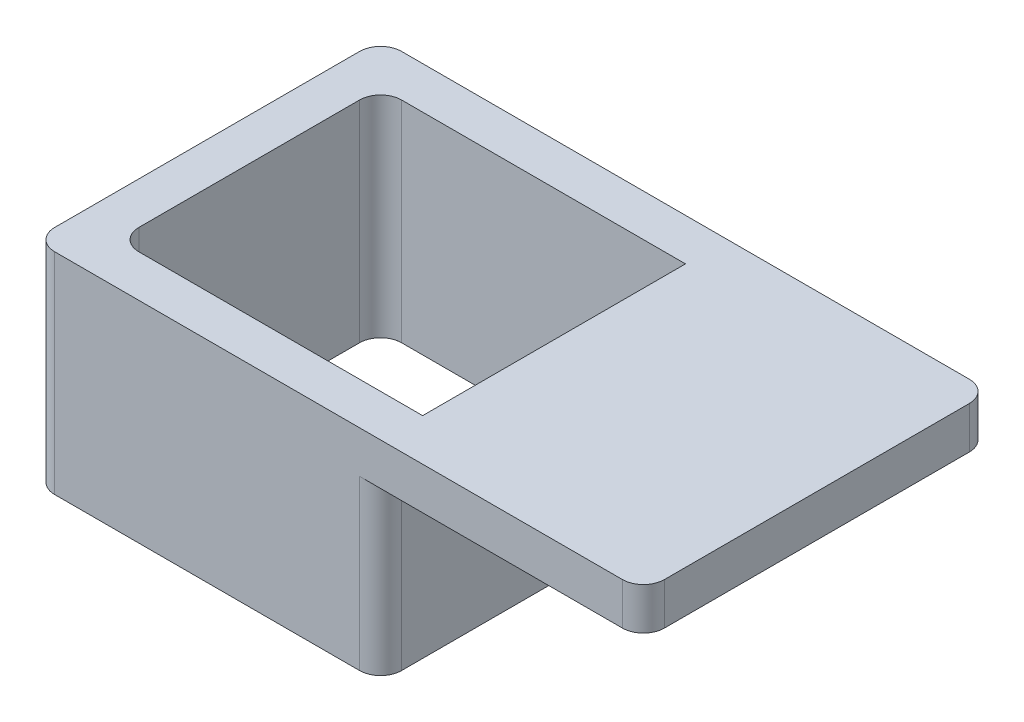
ISO-10303-21;
HEADER;
FILE_DESCRIPTION(('STEP AP214'),'2;1');
FILE_NAME('part.step','',(''),(''),'','','');
FILE_SCHEMA(('AUTOMOTIVE_DESIGN { 1 0 10303 214 1 1 1 1 }'));
ENDSEC;
DATA;
#1=APPLICATION_CONTEXT('core data for automotive mechanical design processes');
#2=APPLICATION_PROTOCOL_DEFINITION('international standard','automotive_design',2000,#1);
#3=PRODUCT_CONTEXT('',#1,'mechanical');
#4=PRODUCT('Part','Part','',(#3));
#5=PRODUCT_RELATED_PRODUCT_CATEGORY('part','',(#4));
#6=PRODUCT_DEFINITION_FORMATION('','',#4);
#7=PRODUCT_DEFINITION_CONTEXT('part definition',#1,'design');
#8=PRODUCT_DEFINITION('design','',#6,#7);
#9=PRODUCT_DEFINITION_SHAPE('','',#8);
#10=(LENGTH_UNIT() NAMED_UNIT(*) SI_UNIT(.MILLI.,.METRE.));
#11=(NAMED_UNIT(*) PLANE_ANGLE_UNIT() SI_UNIT($,.RADIAN.));
#12=(NAMED_UNIT(*) SI_UNIT($,.STERADIAN.) SOLID_ANGLE_UNIT());
#13=UNCERTAINTY_MEASURE_WITH_UNIT(LENGTH_MEASURE(1.E-05),#10,'distance_accuracy_value','');
#14=(GEOMETRIC_REPRESENTATION_CONTEXT(3) GLOBAL_UNCERTAINTY_ASSIGNED_CONTEXT((#13)) GLOBAL_UNIT_ASSIGNED_CONTEXT((#10,
#11,#12)) REPRESENTATION_CONTEXT('',''));
#15=CARTESIAN_POINT('',(0.,0.,0.));
#16=DIRECTION('',(0.,0.,1.));
#17=DIRECTION('',(1.,0.,0.));
#18=AXIS2_PLACEMENT_3D('',#15,#16,#17);
#19=CARTESIAN_POINT('',(8.25,10.,-8.25));
#20=DIRECTION('',(-1.,0.,0.));
#21=DIRECTION('',(0.,0.,1.));
#22=AXIS2_PLACEMENT_3D('',#19,#20,#21);
#23=PLANE('',#22);
#24=DIRECTION('',(0.,0.,-1.));
#25=VECTOR('',#24,1.);
#26=CARTESIAN_POINT('',(8.25,8.,8.25));
#27=LINE('',#26,#25);
#28=CARTESIAN_POINT('',(8.25,8.,7.25));
#29=VERTEX_POINT('',#28);
#30=CARTESIAN_POINT('',(8.25,8.,-7.25));
#31=VERTEX_POINT('',#30);
#32=EDGE_CURVE('E319',#29,#31,#27,.T.);
#33=ORIENTED_EDGE('',*,*,#32,.F.);
#34=DIRECTION('',(0.,-1.,0.));
#35=VECTOR('',#34,1.);
#36=CARTESIAN_POINT('',(8.25,10.,7.25));
#37=LINE('',#36,#35);
#38=CARTESIAN_POINT('',(8.25,0.,7.25));
#39=VERTEX_POINT('',#38);
#40=EDGE_CURVE('E262',#29,#39,#37,.T.);
#41=ORIENTED_EDGE('',*,*,#40,.T.);
#42=DIRECTION('',(0.,0.,-1.));
#43=VECTOR('',#42,1.);
#44=CARTESIAN_POINT('',(8.25,0.,-8.25));
#45=LINE('',#44,#43);
#46=CARTESIAN_POINT('',(8.25,0.,-7.25));
#47=VERTEX_POINT('',#46);
#48=EDGE_CURVE('E217',#39,#47,#45,.T.);
#49=ORIENTED_EDGE('',*,*,#48,.T.);
#50=DIRECTION('',(0.,-1.,0.));
#51=VECTOR('',#50,1.);
#52=CARTESIAN_POINT('',(8.25,10.,-7.25));
#53=LINE('',#52,#51);
#54=EDGE_CURVE('E260',#47,#31,#53,.F.);
#55=ORIENTED_EDGE('',*,*,#54,.T.);
#56=EDGE_LOOP('',(#33,#41,#49,#55));
#57=FACE_BOUND('',#56,.T.);
#58=ADVANCED_FACE('F39',(#57),#23,.F.);
#59=CARTESIAN_POINT('',(0.,10.,0.));
#60=DIRECTION('',(0.,-1.,0.));
#61=DIRECTION('',(0.,0.,-1.));
#62=AXIS2_PLACEMENT_3D('',#59,#60,#61);
#63=PLANE('',#62);
#64=DIRECTION('',(0.,0.,1.));
#65=VECTOR('',#64,1.);
#66=CARTESIAN_POINT('',(20.75,10.,8.25));
#67=LINE('',#66,#65);
#68=CARTESIAN_POINT('',(20.75,10.,-7.25));
#69=VERTEX_POINT('',#68);
#70=CARTESIAN_POINT('',(20.75,10.,7.25));
#71=VERTEX_POINT('',#70);
#72=EDGE_CURVE('E318',#69,#71,#67,.T.);
#73=ORIENTED_EDGE('',*,*,#72,.F.);
#74=CARTESIAN_POINT('',(19.75,10.,-7.25));
#75=DIRECTION('',(0.,-1.,0.));
#76=DIRECTION('',(0.,0.,-1.));
#77=AXIS2_PLACEMENT_3D('',#74,#75,#76);
#78=CIRCLE('',#77,1.);
#79=CARTESIAN_POINT('',(19.75,10.,-8.25));
#80=VERTEX_POINT('',#79);
#81=EDGE_CURVE('E239',#69,#80,#78,.F.);
#82=ORIENTED_EDGE('',*,*,#81,.T.);
#83=DIRECTION('',(-1.,0.,0.));
#84=VECTOR('',#83,1.);
#85=CARTESIAN_POINT('',(8.25,10.,-8.25));
#86=LINE('',#85,#84);
#87=CARTESIAN_POINT('',(-7.25,10.,-8.25));
#88=VERTEX_POINT('',#87);
#89=EDGE_CURVE('E208',#80,#88,#86,.T.);
#90=ORIENTED_EDGE('',*,*,#89,.T.);
#91=CARTESIAN_POINT('',(-7.25,10.,-7.25));
#92=DIRECTION('',(0.,-1.,0.));
#93=DIRECTION('',(0.,0.,-1.));
#94=AXIS2_PLACEMENT_3D('',#91,#92,#93);
#95=CIRCLE('',#94,1.);
#96=CARTESIAN_POINT('',(-8.25,10.,-7.25));
#97=VERTEX_POINT('',#96);
#98=EDGE_CURVE('E235',#88,#97,#95,.F.);
#99=ORIENTED_EDGE('',*,*,#98,.T.);
#100=DIRECTION('',(0.,0.,1.));
#101=VECTOR('',#100,1.);
#102=CARTESIAN_POINT('',(-8.25,10.,-8.25));
#103=LINE('',#102,#101);
#104=CARTESIAN_POINT('',(-8.25,10.,7.25));
#105=VERTEX_POINT('',#104);
#106=EDGE_CURVE('E198',#97,#105,#103,.T.);
#107=ORIENTED_EDGE('',*,*,#106,.T.);
#108=CARTESIAN_POINT('',(-7.25,10.,7.25));
#109=DIRECTION('',(0.,-1.,0.));
#110=DIRECTION('',(0.,0.,-1.));
#111=AXIS2_PLACEMENT_3D('',#108,#109,#110);
#112=CIRCLE('',#111,1.);
#113=CARTESIAN_POINT('',(-7.25,10.,8.25));
#114=VERTEX_POINT('',#113);
#115=EDGE_CURVE('E233',#105,#114,#112,.F.);
#116=ORIENTED_EDGE('',*,*,#115,.T.);
#117=DIRECTION('',(1.,0.,0.));
#118=VECTOR('',#117,1.);
#119=CARTESIAN_POINT('',(8.25,10.,8.25));
#120=LINE('',#119,#118);
#121=CARTESIAN_POINT('',(19.75,10.,8.25));
#122=VERTEX_POINT('',#121);
#123=EDGE_CURVE('E201',#114,#122,#120,.T.);
#124=ORIENTED_EDGE('',*,*,#123,.T.);
#125=CARTESIAN_POINT('',(19.75,10.,7.25));
#126=DIRECTION('',(0.,-1.,0.));
#127=DIRECTION('',(0.,0.,-1.));
#128=AXIS2_PLACEMENT_3D('',#125,#126,#127);
#129=CIRCLE('',#128,1.);
#130=EDGE_CURVE('E237',#122,#71,#129,.F.);
#131=ORIENTED_EDGE('',*,*,#130,.T.);
#132=EDGE_LOOP('',(#73,#82,#90,#99,#107,#116,#124,#131));
#133=FACE_BOUND('',#132,.T.);
#134=DIRECTION('',(-1.,0.,0.));
#135=VECTOR('',#134,1.);
#136=CARTESIAN_POINT('',(6.25,10.,-6.25));
#137=LINE('',#136,#135);
#138=CARTESIAN_POINT('',(8.25,10.,-6.25));
#139=VERTEX_POINT('',#138);
#140=CARTESIAN_POINT('',(-5.25,10.,-6.25));
#141=VERTEX_POINT('',#140);
#142=EDGE_CURVE('E196',#139,#141,#137,.T.);
#143=ORIENTED_EDGE('',*,*,#142,.F.);
#144=DIRECTION('',(0.,0.,-1.));
#145=VECTOR('',#144,1.);
#146=CARTESIAN_POINT('',(8.25,10.,-8.25));
#147=LINE('',#146,#145);
#148=CARTESIAN_POINT('',(8.25,10.,6.25));
#149=VERTEX_POINT('',#148);
#150=EDGE_CURVE('E205',#149,#139,#147,.T.);
#151=ORIENTED_EDGE('',*,*,#150,.F.);
#152=DIRECTION('',(1.,0.,0.));
#153=VECTOR('',#152,1.);
#154=CARTESIAN_POINT('',(6.25,10.,6.25));
#155=LINE('',#154,#153);
#156=CARTESIAN_POINT('',(-5.25,10.,6.25));
#157=VERTEX_POINT('',#156);
#158=EDGE_CURVE('E310',#157,#149,#155,.T.);
#159=ORIENTED_EDGE('',*,*,#158,.F.);
#160=CARTESIAN_POINT('',(-5.25,10.,5.25));
#161=DIRECTION('',(0.,-1.,0.));
#162=DIRECTION('',(0.,0.,-1.));
#163=AXIS2_PLACEMENT_3D('',#160,#161,#162);
#164=CIRCLE('',#163,1.);
#165=CARTESIAN_POINT('',(-6.25,10.,5.25));
#166=VERTEX_POINT('',#165);
#167=EDGE_CURVE('E293',#157,#166,#164,.T.);
#168=ORIENTED_EDGE('',*,*,#167,.T.);
#169=DIRECTION('',(0.,0.,1.));
#170=VECTOR('',#169,1.);
#171=CARTESIAN_POINT('',(-6.25,10.,-6.25));
#172=LINE('',#171,#170);
#173=CARTESIAN_POINT('',(-6.25,10.,-5.25));
#174=VERTEX_POINT('',#173);
#175=EDGE_CURVE('E192',#174,#166,#172,.T.);
#176=ORIENTED_EDGE('',*,*,#175,.F.);
#177=CARTESIAN_POINT('',(-5.25,10.,-5.25));
#178=DIRECTION('',(0.,-1.,0.));
#179=DIRECTION('',(0.,0.,-1.));
#180=AXIS2_PLACEMENT_3D('',#177,#178,#179);
#181=CIRCLE('',#180,1.);
#182=EDGE_CURVE('E11',#174,#141,#181,.T.);
#183=ORIENTED_EDGE('',*,*,#182,.T.);
#184=EDGE_LOOP('',(#143,#151,#159,#168,#176,#183));
#185=FACE_BOUND('',#184,.T.);
#186=ADVANCED_FACE('F306',(#133,#185),#63,.F.);
#187=CARTESIAN_POINT('',(0.,0.,0.));
#188=DIRECTION('',(0.,-1.,0.));
#189=DIRECTION('',(0.,0.,-1.));
#190=AXIS2_PLACEMENT_3D('',#187,#188,#189);
#191=PLANE('',#190);
#192=ORIENTED_EDGE('',*,*,#48,.F.);
#193=CARTESIAN_POINT('',(7.25,0.,7.25));
#194=DIRECTION('',(0.,-1.,0.));
#195=DIRECTION('',(0.,0.,-1.));
#196=AXIS2_PLACEMENT_3D('',#193,#194,#195);
#197=CIRCLE('',#196,1.);
#198=CARTESIAN_POINT('',(7.25,0.,8.25));
#199=VERTEX_POINT('',#198);
#200=EDGE_CURVE('E271',#39,#199,#197,.T.);
#201=ORIENTED_EDGE('',*,*,#200,.T.);
#202=DIRECTION('',(1.,0.,0.));
#203=VECTOR('',#202,1.);
#204=CARTESIAN_POINT('',(8.25,0.,8.25));
#205=LINE('',#204,#203);
#206=CARTESIAN_POINT('',(-7.25,0.,8.25));
#207=VERTEX_POINT('',#206);
#208=EDGE_CURVE('E214',#207,#199,#205,.T.);
#209=ORIENTED_EDGE('',*,*,#208,.F.);
#210=CARTESIAN_POINT('',(-7.25,0.,7.25));
#211=DIRECTION('',(0.,-1.,0.));
#212=DIRECTION('',(0.,0.,-1.));
#213=AXIS2_PLACEMENT_3D('',#210,#211,#212);
#214=CIRCLE('',#213,1.);
#215=CARTESIAN_POINT('',(-8.25,0.,7.25));
#216=VERTEX_POINT('',#215);
#217=EDGE_CURVE('E265',#207,#216,#214,.T.);
#218=ORIENTED_EDGE('',*,*,#217,.T.);
#219=DIRECTION('',(0.,0.,1.));
#220=VECTOR('',#219,1.);
#221=CARTESIAN_POINT('',(-8.25,0.,-8.25));
#222=LINE('',#221,#220);
#223=CARTESIAN_POINT('',(-8.25,0.,-7.25));
#224=VERTEX_POINT('',#223);
#225=EDGE_CURVE('E184',#224,#216,#222,.T.);
#226=ORIENTED_EDGE('',*,*,#225,.F.);
#227=CARTESIAN_POINT('',(-7.25,0.,-7.25));
#228=DIRECTION('',(0.,-1.,0.));
#229=DIRECTION('',(0.,0.,-1.));
#230=AXIS2_PLACEMENT_3D('',#227,#228,#229);
#231=CIRCLE('',#230,1.);
#232=CARTESIAN_POINT('',(-7.25,0.,-8.25));
#233=VERTEX_POINT('',#232);
#234=EDGE_CURVE('E267',#224,#233,#231,.T.);
#235=ORIENTED_EDGE('',*,*,#234,.T.);
#236=DIRECTION('',(-1.,0.,0.));
#237=VECTOR('',#236,1.);
#238=CARTESIAN_POINT('',(8.25,0.,-8.25));
#239=LINE('',#238,#237);
#240=CARTESIAN_POINT('',(7.25,0.,-8.25));
#241=VERTEX_POINT('',#240);
#242=EDGE_CURVE('E202',#241,#233,#239,.T.);
#243=ORIENTED_EDGE('',*,*,#242,.F.);
#244=CARTESIAN_POINT('',(7.25,0.,-7.25));
#245=DIRECTION('',(0.,-1.,0.));
#246=DIRECTION('',(0.,0.,-1.));
#247=AXIS2_PLACEMENT_3D('',#244,#245,#246);
#248=CIRCLE('',#247,1.);
#249=EDGE_CURVE('E269',#241,#47,#248,.T.);
#250=ORIENTED_EDGE('',*,*,#249,.T.);
#251=EDGE_LOOP('',(#192,#201,#209,#218,#226,#235,#243,#250));
#252=FACE_BOUND('',#251,.T.);
#253=DIRECTION('',(-1.,0.,0.));
#254=VECTOR('',#253,1.);
#255=CARTESIAN_POINT('',(6.25,0.,-6.25));
#256=LINE('',#255,#254);
#257=CARTESIAN_POINT('',(6.25,0.,-6.25));
#258=VERTEX_POINT('',#257);
#259=CARTESIAN_POINT('',(-5.25,0.,-6.25));
#260=VERTEX_POINT('',#259);
#261=EDGE_CURVE('E190',#258,#260,#256,.T.);
#262=ORIENTED_EDGE('',*,*,#261,.T.);
#263=CARTESIAN_POINT('',(-5.25,0.,-5.25));
#264=DIRECTION('',(0.,-1.,0.));
#265=DIRECTION('',(0.,0.,-1.));
#266=AXIS2_PLACEMENT_3D('',#263,#264,#265);
#267=CIRCLE('',#266,1.);
#268=CARTESIAN_POINT('',(-6.25,0.,-5.25));
#269=VERTEX_POINT('',#268);
#270=EDGE_CURVE('E47',#260,#269,#267,.F.);
#271=ORIENTED_EDGE('',*,*,#270,.T.);
#272=DIRECTION('',(0.,0.,1.));
#273=VECTOR('',#272,1.);
#274=CARTESIAN_POINT('',(-6.25,0.,-6.25));
#275=LINE('',#274,#273);
#276=CARTESIAN_POINT('',(-6.25,0.,5.25));
#277=VERTEX_POINT('',#276);
#278=EDGE_CURVE('E174',#269,#277,#275,.T.);
#279=ORIENTED_EDGE('',*,*,#278,.T.);
#280=CARTESIAN_POINT('',(-5.25,0.,5.25));
#281=DIRECTION('',(0.,-1.,0.));
#282=DIRECTION('',(0.,0.,-1.));
#283=AXIS2_PLACEMENT_3D('',#280,#281,#282);
#284=CIRCLE('',#283,1.);
#285=CARTESIAN_POINT('',(-5.25,0.,6.25));
#286=VERTEX_POINT('',#285);
#287=EDGE_CURVE('E54',#277,#286,#284,.F.);
#288=ORIENTED_EDGE('',*,*,#287,.T.);
#289=DIRECTION('',(1.,0.,0.));
#290=VECTOR('',#289,1.);
#291=CARTESIAN_POINT('',(6.25,0.,6.25));
#292=LINE('',#291,#290);
#293=CARTESIAN_POINT('',(6.25,0.,6.25));
#294=VERTEX_POINT('',#293);
#295=EDGE_CURVE('E167',#286,#294,#292,.T.);
#296=ORIENTED_EDGE('',*,*,#295,.T.);
#297=DIRECTION('',(0.,0.,-1.));
#298=VECTOR('',#297,1.);
#299=CARTESIAN_POINT('',(6.25,0.,-6.25));
#300=LINE('',#299,#298);
#301=EDGE_CURVE('E172',#294,#258,#300,.T.);
#302=ORIENTED_EDGE('',*,*,#301,.T.);
#303=EDGE_LOOP('',(#262,#271,#279,#288,#296,#302));
#304=FACE_BOUND('',#303,.T.);
#305=ADVANCED_FACE('F170',(#252,#304),#191,.T.);
#306=CARTESIAN_POINT('',(-8.25,10.,-8.25));
#307=DIRECTION('',(1.,0.,0.));
#308=DIRECTION('',(0.,0.,-1.));
#309=AXIS2_PLACEMENT_3D('',#306,#307,#308);
#310=PLANE('',#309);
#311=ORIENTED_EDGE('',*,*,#106,.F.);
#312=DIRECTION('',(0.,-1.,0.));
#313=VECTOR('',#312,1.);
#314=CARTESIAN_POINT('',(-8.25,10.,-7.25));
#315=LINE('',#314,#313);
#316=EDGE_CURVE('E275',#97,#224,#315,.T.);
#317=ORIENTED_EDGE('',*,*,#316,.T.);
#318=ORIENTED_EDGE('',*,*,#225,.T.);
#319=DIRECTION('',(0.,-1.,0.));
#320=VECTOR('',#319,1.);
#321=CARTESIAN_POINT('',(-8.25,10.,7.25));
#322=LINE('',#321,#320);
#323=EDGE_CURVE('E273',#216,#105,#322,.F.);
#324=ORIENTED_EDGE('',*,*,#323,.T.);
#325=EDGE_LOOP('',(#311,#317,#318,#324));
#326=FACE_BOUND('',#325,.T.);
#327=ADVANCED_FACE('F351',(#326),#310,.F.);
#328=CARTESIAN_POINT('',(8.25,10.,8.25));
#329=DIRECTION('',(0.,0.,-1.));
#330=DIRECTION('',(-1.,0.,0.));
#331=AXIS2_PLACEMENT_3D('',#328,#329,#330);
#332=PLANE('',#331);
#333=DIRECTION('',(-1.,0.,0.));
#334=VECTOR('',#333,1.);
#335=CARTESIAN_POINT('',(20.75,8.,8.25));
#336=LINE('',#335,#334);
#337=CARTESIAN_POINT('',(19.75,8.,8.25));
#338=VERTEX_POINT('',#337);
#339=CARTESIAN_POINT('',(7.25,8.,8.25));
#340=VERTEX_POINT('',#339);
#341=EDGE_CURVE('E302',#338,#340,#336,.T.);
#342=ORIENTED_EDGE('',*,*,#341,.F.);
#343=DIRECTION('',(0.,-1.,0.));
#344=VECTOR('',#343,1.);
#345=CARTESIAN_POINT('',(19.75,10.,8.25));
#346=LINE('',#345,#344);
#347=EDGE_CURVE('E258',#338,#122,#346,.F.);
#348=ORIENTED_EDGE('',*,*,#347,.T.);
#349=ORIENTED_EDGE('',*,*,#123,.F.);
#350=DIRECTION('',(0.,-1.,0.));
#351=VECTOR('',#350,1.);
#352=CARTESIAN_POINT('',(-7.25,10.,8.25));
#353=LINE('',#352,#351);
#354=EDGE_CURVE('E252',#114,#207,#353,.T.);
#355=ORIENTED_EDGE('',*,*,#354,.T.);
#356=ORIENTED_EDGE('',*,*,#208,.T.);
#357=DIRECTION('',(0.,-1.,0.));
#358=VECTOR('',#357,1.);
#359=CARTESIAN_POINT('',(7.25,10.,8.25));
#360=LINE('',#359,#358);
#361=EDGE_CURVE('E255',#199,#340,#360,.F.);
#362=ORIENTED_EDGE('',*,*,#361,.T.);
#363=EDGE_LOOP('',(#342,#348,#349,#355,#356,#362));
#364=FACE_BOUND('',#363,.T.);
#365=ADVANCED_FACE('F361',(#364),#332,.F.);
#366=CARTESIAN_POINT('',(8.25,10.,-8.25));
#367=DIRECTION('',(0.,0.,1.));
#368=DIRECTION('',(1.,0.,0.));
#369=AXIS2_PLACEMENT_3D('',#366,#367,#368);
#370=PLANE('',#369);
#371=ORIENTED_EDGE('',*,*,#89,.F.);
#372=DIRECTION('',(0.,1.,0.));
#373=VECTOR('',#372,1.);
#374=CARTESIAN_POINT('',(19.75,8.,-8.25));
#375=LINE('',#374,#373);
#376=CARTESIAN_POINT('',(19.75,8.,-8.25));
#377=VERTEX_POINT('',#376);
#378=EDGE_CURVE('E246',#80,#377,#375,.F.);
#379=ORIENTED_EDGE('',*,*,#378,.T.);
#380=DIRECTION('',(-1.,0.,0.));
#381=VECTOR('',#380,1.);
#382=CARTESIAN_POINT('',(20.75,8.,-8.25));
#383=LINE('',#382,#381);
#384=CARTESIAN_POINT('',(7.25,8.,-8.25));
#385=VERTEX_POINT('',#384);
#386=EDGE_CURVE('E316',#377,#385,#383,.T.);
#387=ORIENTED_EDGE('',*,*,#386,.T.);
#388=DIRECTION('',(0.,-1.,0.));
#389=VECTOR('',#388,1.);
#390=CARTESIAN_POINT('',(7.25,10.,-8.25));
#391=LINE('',#390,#389);
#392=EDGE_CURVE('E243',#385,#241,#391,.T.);
#393=ORIENTED_EDGE('',*,*,#392,.T.);
#394=ORIENTED_EDGE('',*,*,#242,.T.);
#395=DIRECTION('',(0.,-1.,0.));
#396=VECTOR('',#395,1.);
#397=CARTESIAN_POINT('',(-7.25,10.,-8.25));
#398=LINE('',#397,#396);
#399=EDGE_CURVE('E241',#233,#88,#398,.F.);
#400=ORIENTED_EDGE('',*,*,#399,.T.);
#401=EDGE_LOOP('',(#371,#379,#387,#393,#394,#400));
#402=FACE_BOUND('',#401,.T.);
#403=ADVANCED_FACE('F341',(#402),#370,.F.);
#404=CARTESIAN_POINT('',(-6.25,10.,-6.25));
#405=DIRECTION('',(1.,0.,0.));
#406=DIRECTION('',(0.,0.,-1.));
#407=AXIS2_PLACEMENT_3D('',#404,#405,#406);
#408=PLANE('',#407);
#409=ORIENTED_EDGE('',*,*,#175,.T.);
#410=DIRECTION('',(0.,-1.,0.));
#411=VECTOR('',#410,1.);
#412=CARTESIAN_POINT('',(-6.25,0.,5.25));
#413=LINE('',#412,#411);
#414=EDGE_CURVE('E280',#166,#277,#413,.T.);
#415=ORIENTED_EDGE('',*,*,#414,.T.);
#416=ORIENTED_EDGE('',*,*,#278,.F.);
#417=DIRECTION('',(0.,-1.,0.));
#418=VECTOR('',#417,1.);
#419=CARTESIAN_POINT('',(-6.25,10.,-5.25));
#420=LINE('',#419,#418);
#421=EDGE_CURVE('E278',#269,#174,#420,.F.);
#422=ORIENTED_EDGE('',*,*,#421,.T.);
#423=EDGE_LOOP('',(#409,#415,#416,#422));
#424=FACE_BOUND('',#423,.T.);
#425=ADVANCED_FACE('F300',(#424),#408,.T.);
#426=CARTESIAN_POINT('',(6.25,10.,6.25));
#427=DIRECTION('',(0.,0.,-1.));
#428=DIRECTION('',(-1.,0.,0.));
#429=AXIS2_PLACEMENT_3D('',#426,#427,#428);
#430=PLANE('',#429);
#431=ORIENTED_EDGE('',*,*,#295,.F.);
#432=DIRECTION('',(0.,-1.,0.));
#433=VECTOR('',#432,1.);
#434=CARTESIAN_POINT('',(-5.25,10.,6.25));
#435=LINE('',#434,#433);
#436=EDGE_CURVE('E282',#286,#157,#435,.F.);
#437=ORIENTED_EDGE('',*,*,#436,.T.);
#438=ORIENTED_EDGE('',*,*,#158,.T.);
#439=DIRECTION('',(-0.707106781186549,-0.707106781186546,0.));
#440=VECTOR('',#439,1.);
#441=CARTESIAN_POINT('',(6.25,7.99999999999999,6.25));
#442=LINE('',#441,#440);
#443=CARTESIAN_POINT('',(6.25,7.99999999999999,6.25));
#444=VERTEX_POINT('',#443);
#445=EDGE_CURVE('E180',#149,#444,#442,.T.);
#446=ORIENTED_EDGE('',*,*,#445,.T.);
#447=DIRECTION('',(0.,-1.,0.));
#448=VECTOR('',#447,1.);
#449=CARTESIAN_POINT('',(6.25,10.,6.25));
#450=LINE('',#449,#448);
#451=EDGE_CURVE('E177',#444,#294,#450,.T.);
#452=ORIENTED_EDGE('',*,*,#451,.T.);
#453=EDGE_LOOP('',(#431,#437,#438,#446,#452));
#454=FACE_BOUND('',#453,.T.);
#455=ADVANCED_FACE('F178',(#454),#430,.T.);
#456=CARTESIAN_POINT('',(6.25,10.,-6.25));
#457=DIRECTION('',(-1.,0.,0.));
#458=DIRECTION('',(0.,0.,1.));
#459=AXIS2_PLACEMENT_3D('',#456,#457,#458);
#460=PLANE('',#459);
#461=ORIENTED_EDGE('',*,*,#451,.F.);
#462=DIRECTION('',(0.,0.,-1.));
#463=VECTOR('',#462,1.);
#464=CARTESIAN_POINT('',(6.25,7.99999999999999,-6.25));
#465=LINE('',#464,#463);
#466=CARTESIAN_POINT('',(6.25,7.99999999999999,-6.25));
#467=VERTEX_POINT('',#466);
#468=EDGE_CURVE('E211',#444,#467,#465,.T.);
#469=ORIENTED_EDGE('',*,*,#468,.T.);
#470=DIRECTION('',(0.,-1.,0.));
#471=VECTOR('',#470,1.);
#472=CARTESIAN_POINT('',(6.25,10.,-6.25));
#473=LINE('',#472,#471);
#474=EDGE_CURVE('E185',#467,#258,#473,.T.);
#475=ORIENTED_EDGE('',*,*,#474,.T.);
#476=ORIENTED_EDGE('',*,*,#301,.F.);
#477=EDGE_LOOP('',(#461,#469,#475,#476));
#478=FACE_BOUND('',#477,.T.);
#479=ADVANCED_FACE('F187',(#478),#460,.T.);
#480=CARTESIAN_POINT('',(6.25,10.,-6.25));
#481=DIRECTION('',(0.,0.,1.));
#482=DIRECTION('',(1.,0.,0.));
#483=AXIS2_PLACEMENT_3D('',#480,#481,#482);
#484=PLANE('',#483);
#485=ORIENTED_EDGE('',*,*,#142,.T.);
#486=DIRECTION('',(0.,-1.,0.));
#487=VECTOR('',#486,1.);
#488=CARTESIAN_POINT('',(-5.25,0.,-6.25));
#489=LINE('',#488,#487);
#490=EDGE_CURVE('E284',#141,#260,#489,.T.);
#491=ORIENTED_EDGE('',*,*,#490,.T.);
#492=ORIENTED_EDGE('',*,*,#261,.F.);
#493=ORIENTED_EDGE('',*,*,#474,.F.);
#494=DIRECTION('',(0.707106781186549,0.707106781186546,0.));
#495=VECTOR('',#494,1.);
#496=CARTESIAN_POINT('',(6.25,7.99999999999999,-6.25));
#497=LINE('',#496,#495);
#498=EDGE_CURVE('E223',#467,#139,#497,.T.);
#499=ORIENTED_EDGE('',*,*,#498,.T.);
#500=EDGE_LOOP('',(#485,#491,#492,#493,#499));
#501=FACE_BOUND('',#500,.T.);
#502=ADVANCED_FACE('F309',(#501),#484,.T.);
#503=CARTESIAN_POINT('',(6.25,7.99999999999999,-6.25));
#504=DIRECTION('',(-0.707106781186546,0.707106781186549,0.));
#505=DIRECTION('',(0.,0.,1.));
#506=AXIS2_PLACEMENT_3D('',#503,#504,#505);
#507=PLANE('',#506);
#508=ORIENTED_EDGE('',*,*,#445,.F.);
#509=ORIENTED_EDGE('',*,*,#150,.T.);
#510=ORIENTED_EDGE('',*,*,#498,.F.);
#511=ORIENTED_EDGE('',*,*,#468,.F.);
#512=EDGE_LOOP('',(#508,#509,#510,#511));
#513=FACE_BOUND('',#512,.T.);
#514=ADVANCED_FACE('F403',(#513),#507,.T.);
#515=CARTESIAN_POINT('',(20.75,8.,8.25));
#516=DIRECTION('',(0.,1.,0.));
#517=DIRECTION('',(0.,0.,1.));
#518=AXIS2_PLACEMENT_3D('',#515,#516,#517);
#519=PLANE('',#518);
#520=ORIENTED_EDGE('',*,*,#386,.F.);
#521=CARTESIAN_POINT('',(19.75,8.,-7.25));
#522=DIRECTION('',(0.,1.,0.));
#523=DIRECTION('',(0.,0.,1.));
#524=AXIS2_PLACEMENT_3D('',#521,#522,#523);
#525=CIRCLE('',#524,1.);
#526=CARTESIAN_POINT('',(20.75,8.,-7.25));
#527=VERTEX_POINT('',#526);
#528=EDGE_CURVE('E250',#377,#527,#525,.F.);
#529=ORIENTED_EDGE('',*,*,#528,.T.);
#530=DIRECTION('',(0.,0.,-1.));
#531=VECTOR('',#530,1.);
#532=CARTESIAN_POINT('',(20.75,8.,8.25));
#533=LINE('',#532,#531);
#534=CARTESIAN_POINT('',(20.75,8.,7.25));
#535=VERTEX_POINT('',#534);
#536=EDGE_CURVE('E322',#535,#527,#533,.T.);
#537=ORIENTED_EDGE('',*,*,#536,.F.);
#538=CARTESIAN_POINT('',(19.75,8.,7.25));
#539=DIRECTION('',(0.,1.,0.));
#540=DIRECTION('',(0.,0.,1.));
#541=AXIS2_PLACEMENT_3D('',#538,#539,#540);
#542=CIRCLE('',#541,1.);
#543=EDGE_CURVE('E248',#535,#338,#542,.F.);
#544=ORIENTED_EDGE('',*,*,#543,.T.);
#545=ORIENTED_EDGE('',*,*,#341,.T.);
#546=CARTESIAN_POINT('',(7.25,8.,7.25));
#547=DIRECTION('',(0.,1.,0.));
#548=DIRECTION('',(0.,0.,1.));
#549=AXIS2_PLACEMENT_3D('',#546,#547,#548);
#550=CIRCLE('',#549,1.);
#551=EDGE_CURVE('E287',#340,#29,#550,.T.);
#552=ORIENTED_EDGE('',*,*,#551,.T.);
#553=ORIENTED_EDGE('',*,*,#32,.T.);
#554=CARTESIAN_POINT('',(7.25,8.,-7.25));
#555=DIRECTION('',(0.,1.,0.));
#556=DIRECTION('',(0.,0.,1.));
#557=AXIS2_PLACEMENT_3D('',#554,#555,#556);
#558=CIRCLE('',#557,1.);
#559=EDGE_CURVE('E289',#31,#385,#558,.T.);
#560=ORIENTED_EDGE('',*,*,#559,.T.);
#561=EDGE_LOOP('',(#520,#529,#537,#544,#545,#552,#553,#560));
#562=FACE_BOUND('',#561,.T.);
#563=ADVANCED_FACE('F366',(#562),#519,.F.);
#564=CARTESIAN_POINT('',(20.75,0.,0.));
#565=DIRECTION('',(1.,0.,0.));
#566=DIRECTION('',(0.,0.,-1.));
#567=AXIS2_PLACEMENT_3D('',#564,#565,#566);
#568=PLANE('',#567);
#569=ORIENTED_EDGE('',*,*,#536,.T.);
#570=DIRECTION('',(0.,1.,0.));
#571=VECTOR('',#570,1.);
#572=CARTESIAN_POINT('',(20.75,10.,-7.25));
#573=LINE('',#572,#571);
#574=EDGE_CURVE('E230',#527,#69,#573,.T.);
#575=ORIENTED_EDGE('',*,*,#574,.T.);
#576=ORIENTED_EDGE('',*,*,#72,.T.);
#577=DIRECTION('',(0.,-1.,0.));
#578=VECTOR('',#577,1.);
#579=CARTESIAN_POINT('',(20.75,8.,7.25));
#580=LINE('',#579,#578);
#581=EDGE_CURVE('E227',#71,#535,#580,.T.);
#582=ORIENTED_EDGE('',*,*,#581,.T.);
#583=EDGE_LOOP('',(#569,#575,#576,#582));
#584=FACE_BOUND('',#583,.T.);
#585=ADVANCED_FACE('F329',(#584),#568,.T.);
#586=CARTESIAN_POINT('',(19.75,0.,-7.25));
#587=DIRECTION('',(0.,-1.,0.));
#588=DIRECTION('',(0.,0.,-1.));
#589=AXIS2_PLACEMENT_3D('',#586,#587,#588);
#590=CYLINDRICAL_SURFACE('',#589,1.);
#591=ORIENTED_EDGE('',*,*,#528,.F.);
#592=ORIENTED_EDGE('',*,*,#378,.F.);
#593=ORIENTED_EDGE('',*,*,#81,.F.);
#594=ORIENTED_EDGE('',*,*,#574,.F.);
#595=EDGE_LOOP('',(#591,#592,#593,#594));
#596=FACE_BOUND('',#595,.T.);
#597=ADVANCED_FACE('F335',(#596),#590,.T.);
#598=CARTESIAN_POINT('',(19.75,0.,7.25));
#599=DIRECTION('',(0.,1.,0.));
#600=DIRECTION('',(0.,0.,1.));
#601=AXIS2_PLACEMENT_3D('',#598,#599,#600);
#602=CYLINDRICAL_SURFACE('',#601,1.);
#603=ORIENTED_EDGE('',*,*,#130,.F.);
#604=ORIENTED_EDGE('',*,*,#347,.F.);
#605=ORIENTED_EDGE('',*,*,#543,.F.);
#606=ORIENTED_EDGE('',*,*,#581,.F.);
#607=EDGE_LOOP('',(#603,#604,#605,#606));
#608=FACE_BOUND('',#607,.T.);
#609=ADVANCED_FACE('F365',(#608),#602,.T.);
#610=CARTESIAN_POINT('',(7.25,10.,7.25));
#611=DIRECTION('',(0.,-1.,0.));
#612=DIRECTION('',(0.,0.,-1.));
#613=AXIS2_PLACEMENT_3D('',#610,#611,#612);
#614=CYLINDRICAL_SURFACE('',#613,1.);
#615=ORIENTED_EDGE('',*,*,#551,.F.);
#616=ORIENTED_EDGE('',*,*,#361,.F.);
#617=ORIENTED_EDGE('',*,*,#200,.F.);
#618=ORIENTED_EDGE('',*,*,#40,.F.);
#619=EDGE_LOOP('',(#615,#616,#617,#618));
#620=FACE_BOUND('',#619,.T.);
#621=ADVANCED_FACE('F372',(#620),#614,.T.);
#622=CARTESIAN_POINT('',(7.25,10.,-7.25));
#623=DIRECTION('',(0.,-1.,0.));
#624=DIRECTION('',(0.,0.,-1.));
#625=AXIS2_PLACEMENT_3D('',#622,#623,#624);
#626=CYLINDRICAL_SURFACE('',#625,1.);
#627=ORIENTED_EDGE('',*,*,#559,.F.);
#628=ORIENTED_EDGE('',*,*,#54,.F.);
#629=ORIENTED_EDGE('',*,*,#249,.F.);
#630=ORIENTED_EDGE('',*,*,#392,.F.);
#631=EDGE_LOOP('',(#627,#628,#629,#630));
#632=FACE_BOUND('',#631,.T.);
#633=ADVANCED_FACE('F380',(#632),#626,.T.);
#634=CARTESIAN_POINT('',(-7.25,10.,-7.25));
#635=DIRECTION('',(0.,-1.,0.));
#636=DIRECTION('',(0.,0.,-1.));
#637=AXIS2_PLACEMENT_3D('',#634,#635,#636);
#638=CYLINDRICAL_SURFACE('',#637,1.);
#639=ORIENTED_EDGE('',*,*,#98,.F.);
#640=ORIENTED_EDGE('',*,*,#399,.F.);
#641=ORIENTED_EDGE('',*,*,#234,.F.);
#642=ORIENTED_EDGE('',*,*,#316,.F.);
#643=EDGE_LOOP('',(#639,#640,#641,#642));
#644=FACE_BOUND('',#643,.T.);
#645=ADVANCED_FACE('F346',(#644),#638,.T.);
#646=CARTESIAN_POINT('',(-7.25,10.,7.25));
#647=DIRECTION('',(0.,-1.,0.));
#648=DIRECTION('',(0.,0.,-1.));
#649=AXIS2_PLACEMENT_3D('',#646,#647,#648);
#650=CYLINDRICAL_SURFACE('',#649,1.);
#651=ORIENTED_EDGE('',*,*,#115,.F.);
#652=ORIENTED_EDGE('',*,*,#323,.F.);
#653=ORIENTED_EDGE('',*,*,#217,.F.);
#654=ORIENTED_EDGE('',*,*,#354,.F.);
#655=EDGE_LOOP('',(#651,#652,#653,#654));
#656=FACE_BOUND('',#655,.T.);
#657=ADVANCED_FACE('F355',(#656),#650,.T.);
#658=CARTESIAN_POINT('',(-5.25,10.,5.25));
#659=DIRECTION('',(0.,1.,0.));
#660=DIRECTION('',(0.,0.,1.));
#661=AXIS2_PLACEMENT_3D('',#658,#659,#660);
#662=CYLINDRICAL_SURFACE('',#661,1.);
#663=ORIENTED_EDGE('',*,*,#167,.F.);
#664=ORIENTED_EDGE('',*,*,#436,.F.);
#665=ORIENTED_EDGE('',*,*,#287,.F.);
#666=ORIENTED_EDGE('',*,*,#414,.F.);
#667=EDGE_LOOP('',(#663,#664,#665,#666));
#668=FACE_BOUND('',#667,.T.);
#669=ADVANCED_FACE('F443',(#668),#662,.F.);
#670=CARTESIAN_POINT('',(-5.25,10.,-5.25));
#671=DIRECTION('',(0.,1.,0.));
#672=DIRECTION('',(0.,0.,1.));
#673=AXIS2_PLACEMENT_3D('',#670,#671,#672);
#674=CYLINDRICAL_SURFACE('',#673,1.);
#675=ORIENTED_EDGE('',*,*,#182,.F.);
#676=ORIENTED_EDGE('',*,*,#421,.F.);
#677=ORIENTED_EDGE('',*,*,#270,.F.);
#678=ORIENTED_EDGE('',*,*,#490,.F.);
#679=EDGE_LOOP('',(#675,#676,#677,#678));
#680=FACE_BOUND('',#679,.T.);
#681=ADVANCED_FACE('F41',(#680),#674,.F.);
#682=CLOSED_SHELL('',(#58,#186,#305,#327,#365,#403,#425,#455,#479,#502,#514,#563,#585,#597,#609,
#621,#633,#645,#657,#669,#681));
#683=MANIFOLD_SOLID_BREP('B2',#682);
#684=ADVANCED_BREP_SHAPE_REPRESENTATION('',(#18,#683),#14);
#685=SHAPE_DEFINITION_REPRESENTATION(#9,#684);
ENDSEC;
END-ISO-10303-21;
